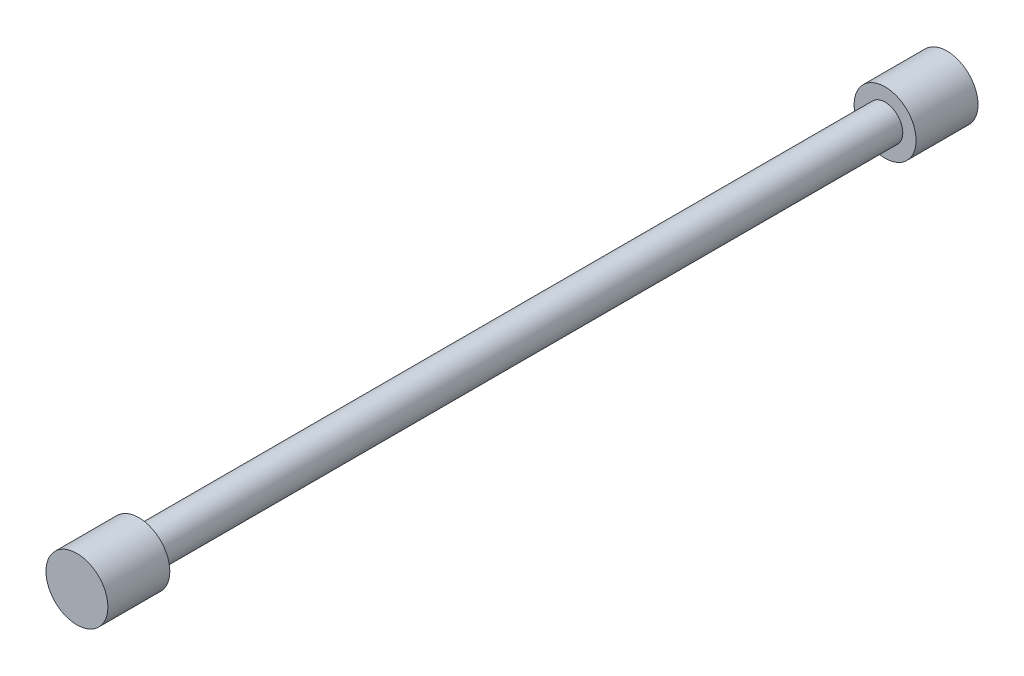
ISO-10303-21;
HEADER;
FILE_DESCRIPTION(('STEP AP214'),'2;1');
FILE_NAME('part.step','',(''),(''),'','','');
FILE_SCHEMA(('AUTOMOTIVE_DESIGN { 1 0 10303 214 1 1 1 1 }'));
ENDSEC;
DATA;
#1=APPLICATION_CONTEXT('core data for automotive mechanical design processes');
#2=APPLICATION_PROTOCOL_DEFINITION('international standard','automotive_design',2000,#1);
#3=PRODUCT_CONTEXT('',#1,'mechanical');
#4=PRODUCT('Part','Part','',(#3));
#5=PRODUCT_RELATED_PRODUCT_CATEGORY('part','',(#4));
#6=PRODUCT_DEFINITION_FORMATION('','',#4);
#7=PRODUCT_DEFINITION_CONTEXT('part definition',#1,'design');
#8=PRODUCT_DEFINITION('design','',#6,#7);
#9=PRODUCT_DEFINITION_SHAPE('','',#8);
#10=(LENGTH_UNIT() NAMED_UNIT(*) SI_UNIT(.MILLI.,.METRE.));
#11=(NAMED_UNIT(*) PLANE_ANGLE_UNIT() SI_UNIT($,.RADIAN.));
#12=(NAMED_UNIT(*) SI_UNIT($,.STERADIAN.) SOLID_ANGLE_UNIT());
#13=UNCERTAINTY_MEASURE_WITH_UNIT(LENGTH_MEASURE(1.E-05),#10,'distance_accuracy_value','');
#14=(GEOMETRIC_REPRESENTATION_CONTEXT(3) GLOBAL_UNCERTAINTY_ASSIGNED_CONTEXT((#13)) GLOBAL_UNIT_ASSIGNED_CONTEXT((#10,
#11,#12)) REPRESENTATION_CONTEXT('',''));
#15=CARTESIAN_POINT('',(0.,0.,0.));
#16=DIRECTION('',(0.,0.,1.));
#17=DIRECTION('',(1.,0.,0.));
#18=AXIS2_PLACEMENT_3D('',#15,#16,#17);
#19=CARTESIAN_POINT('',(0.,0.,7.));
#20=DIRECTION('',(0.,0.,1.));
#21=DIRECTION('',(1.,0.,0.));
#22=AXIS2_PLACEMENT_3D('',#19,#20,#21);
#23=PLANE('',#22);
#24=CARTESIAN_POINT('',(0.,0.,7.));
#25=DIRECTION('',(0.,0.,1.));
#26=DIRECTION('',(1.,0.,0.));
#27=AXIS2_PLACEMENT_3D('',#24,#25,#26);
#28=CIRCLE('',#27,7.);
#29=CARTESIAN_POINT('',(7.,0.,7.));
#30=VERTEX_POINT('',#29);
#31=EDGE_CURVE('E10',#30,#30,#28,.T.);
#32=ORIENTED_EDGE('',*,*,#31,.T.);
#33=EDGE_LOOP('',(#32));
#34=FACE_BOUND('',#33,.T.);
#35=ADVANCED_FACE('F40',(#34),#23,.T.);
#36=CARTESIAN_POINT('',(0.,0.,10.));
#37=DIRECTION('',(0.,0.,1.));
#38=DIRECTION('',(1.,0.,0.));
#39=AXIS2_PLACEMENT_3D('',#36,#37,#38);
#40=CYLINDRICAL_SURFACE('',#39,7.);
#41=CARTESIAN_POINT('',(0.,0.,-7.));
#42=DIRECTION('',(0.,0.,1.));
#43=DIRECTION('',(1.,0.,0.));
#44=AXIS2_PLACEMENT_3D('',#41,#42,#43);
#45=CIRCLE('',#44,7.);
#46=CARTESIAN_POINT('',(7.,0.,-7.));
#47=VERTEX_POINT('',#46);
#48=EDGE_CURVE('E43',#47,#47,#45,.T.);
#49=ORIENTED_EDGE('',*,*,#48,.T.);
#50=EDGE_LOOP('',(#49));
#51=FACE_BOUND('',#50,.T.);
#52=ORIENTED_EDGE('',*,*,#31,.F.);
#53=EDGE_LOOP('',(#52));
#54=FACE_BOUND('',#53,.T.);
#55=ADVANCED_FACE('F73',(#51,#54),#40,.T.);
#56=CARTESIAN_POINT('',(7.,0.,-7.));
#57=DIRECTION('',(0.,0.,-1.));
#58=DIRECTION('',(-1.,0.,0.));
#59=AXIS2_PLACEMENT_3D('',#56,#57,#58);
#60=PLANE('',#59);
#61=CARTESIAN_POINT('',(0.,0.,-7.));
#62=DIRECTION('',(0.,0.,1.));
#63=DIRECTION('',(1.,0.,0.));
#64=AXIS2_PLACEMENT_3D('',#61,#62,#63);
#65=CIRCLE('',#64,4.);
#66=CARTESIAN_POINT('',(4.,0.,-7.));
#67=VERTEX_POINT('',#66);
#68=EDGE_CURVE('E50',#67,#67,#65,.T.);
#69=ORIENTED_EDGE('',*,*,#68,.T.);
#70=EDGE_LOOP('',(#69));
#71=FACE_BOUND('',#70,.T.);
#72=ORIENTED_EDGE('',*,*,#48,.F.);
#73=EDGE_LOOP('',(#72));
#74=FACE_BOUND('',#73,.T.);
#75=ADVANCED_FACE('F80',(#71,#74),#60,.T.);
#76=CARTESIAN_POINT('',(0.,0.,10.));
#77=DIRECTION('',(0.,0.,1.));
#78=DIRECTION('',(1.,0.,0.));
#79=AXIS2_PLACEMENT_3D('',#76,#77,#78);
#80=CYLINDRICAL_SURFACE('',#79,4.);
#81=CARTESIAN_POINT('',(0.,0.,-175.669099740487));
#82=DIRECTION('',(0.,0.,1.));
#83=DIRECTION('',(1.,0.,0.));
#84=AXIS2_PLACEMENT_3D('',#81,#82,#83);
#85=CIRCLE('',#84,4.);
#86=CARTESIAN_POINT('',(4.,0.,-175.669099740487));
#87=VERTEX_POINT('',#86);
#88=EDGE_CURVE('E51',#87,#87,#85,.T.);
#89=ORIENTED_EDGE('',*,*,#88,.T.);
#90=EDGE_LOOP('',(#89));
#91=FACE_BOUND('',#90,.T.);
#92=ORIENTED_EDGE('',*,*,#68,.F.);
#93=EDGE_LOOP('',(#92));
#94=FACE_BOUND('',#93,.T.);
#95=ADVANCED_FACE('F81',(#91,#94),#80,.T.);
#96=CARTESIAN_POINT('',(4.,0.,-175.669099740487));
#97=DIRECTION('',(0.,0.,1.));
#98=DIRECTION('',(1.,0.,0.));
#99=AXIS2_PLACEMENT_3D('',#96,#97,#98);
#100=PLANE('',#99);
#101=CARTESIAN_POINT('',(0.,0.,-175.669099740487));
#102=DIRECTION('',(0.,0.,1.));
#103=DIRECTION('',(1.,0.,0.));
#104=AXIS2_PLACEMENT_3D('',#101,#102,#103);
#105=CIRCLE('',#104,7.);
#106=CARTESIAN_POINT('',(7.,0.,-175.669099740487));
#107=VERTEX_POINT('',#106);
#108=EDGE_CURVE('E57',#107,#107,#105,.T.);
#109=ORIENTED_EDGE('',*,*,#108,.T.);
#110=EDGE_LOOP('',(#109));
#111=FACE_BOUND('',#110,.T.);
#112=ORIENTED_EDGE('',*,*,#88,.F.);
#113=EDGE_LOOP('',(#112));
#114=FACE_BOUND('',#113,.T.);
#115=ADVANCED_FACE('F74',(#111,#114),#100,.T.);
#116=CARTESIAN_POINT('',(0.,0.,10.));
#117=DIRECTION('',(0.,0.,1.));
#118=DIRECTION('',(1.,0.,0.));
#119=AXIS2_PLACEMENT_3D('',#116,#117,#118);
#120=CYLINDRICAL_SURFACE('',#119,7.);
#121=CARTESIAN_POINT('',(0.,0.,-189.669099740487));
#122=DIRECTION('',(0.,0.,1.));
#123=DIRECTION('',(1.,0.,0.));
#124=AXIS2_PLACEMENT_3D('',#121,#122,#123);
#125=CIRCLE('',#124,7.);
#126=CARTESIAN_POINT('',(7.,0.,-189.669099740487));
#127=VERTEX_POINT('',#126);
#128=EDGE_CURVE('E56',#127,#127,#125,.T.);
#129=ORIENTED_EDGE('',*,*,#128,.T.);
#130=EDGE_LOOP('',(#129));
#131=FACE_BOUND('',#130,.T.);
#132=ORIENTED_EDGE('',*,*,#108,.F.);
#133=EDGE_LOOP('',(#132));
#134=FACE_BOUND('',#133,.T.);
#135=ADVANCED_FACE('F65',(#131,#134),#120,.T.);
#136=CARTESIAN_POINT('',(7.,0.,-189.669099740487));
#137=DIRECTION('',(0.,0.,-1.));
#138=DIRECTION('',(-1.,0.,0.));
#139=AXIS2_PLACEMENT_3D('',#136,#137,#138);
#140=PLANE('',#139);
#141=ORIENTED_EDGE('',*,*,#128,.F.);
#142=EDGE_LOOP('',(#141));
#143=FACE_BOUND('',#142,.T.);
#144=ADVANCED_FACE('F67',(#143),#140,.T.);
#145=CLOSED_SHELL('',(#35,#55,#75,#95,#115,#135,#144));
#146=MANIFOLD_SOLID_BREP('B2',#145);
#147=ADVANCED_BREP_SHAPE_REPRESENTATION('',(#18,#146),#14);
#148=SHAPE_DEFINITION_REPRESENTATION(#9,#147);
ENDSEC;
END-ISO-10303-21;
